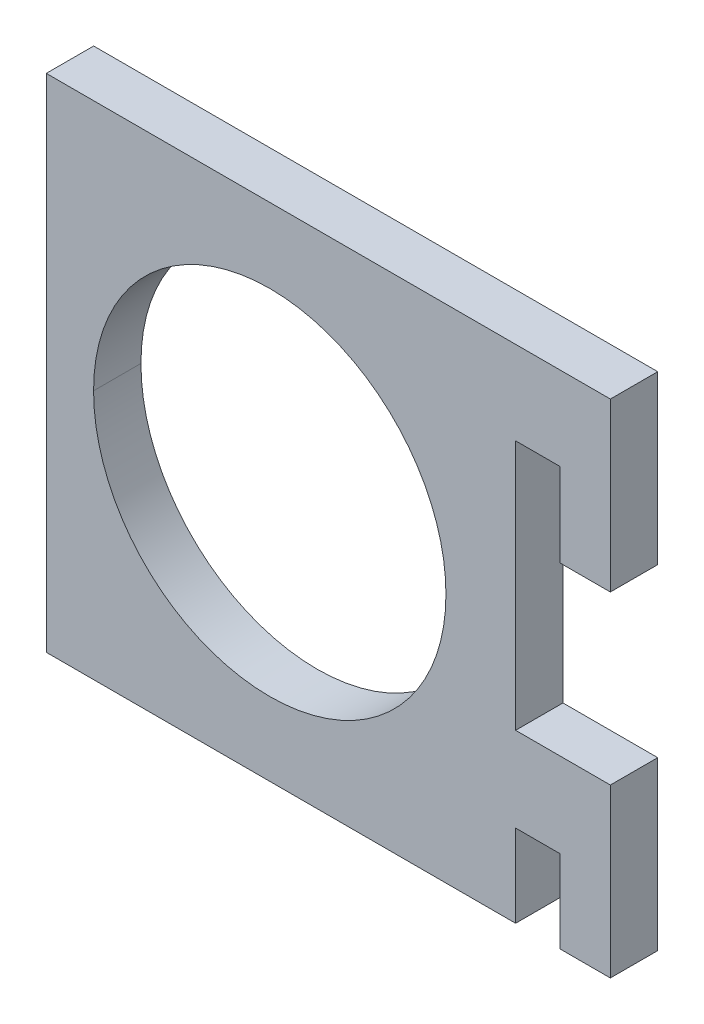
ISO-10303-21;
HEADER;
FILE_DESCRIPTION(('STEP AP214'),'2;1');
FILE_NAME('part.step','',(''),(''),'','','');
FILE_SCHEMA(('AUTOMOTIVE_DESIGN { 1 0 10303 214 1 1 1 1 }'));
ENDSEC;
DATA;
#1=APPLICATION_CONTEXT('core data for automotive mechanical design processes');
#2=APPLICATION_PROTOCOL_DEFINITION('international standard','automotive_design',2000,#1);
#3=PRODUCT_CONTEXT('',#1,'mechanical');
#4=PRODUCT('Part','Part','',(#3));
#5=PRODUCT_RELATED_PRODUCT_CATEGORY('part','',(#4));
#6=PRODUCT_DEFINITION_FORMATION('','',#4);
#7=PRODUCT_DEFINITION_CONTEXT('part definition',#1,'design');
#8=PRODUCT_DEFINITION('design','',#6,#7);
#9=PRODUCT_DEFINITION_SHAPE('','',#8);
#10=(LENGTH_UNIT() NAMED_UNIT(*) SI_UNIT(.MILLI.,.METRE.));
#11=(NAMED_UNIT(*) PLANE_ANGLE_UNIT() SI_UNIT($,.RADIAN.));
#12=(NAMED_UNIT(*) SI_UNIT($,.STERADIAN.) SOLID_ANGLE_UNIT());
#13=UNCERTAINTY_MEASURE_WITH_UNIT(LENGTH_MEASURE(1.E-05),#10,'distance_accuracy_value','');
#14=(GEOMETRIC_REPRESENTATION_CONTEXT(3) GLOBAL_UNCERTAINTY_ASSIGNED_CONTEXT((#13)) GLOBAL_UNIT_ASSIGNED_CONTEXT((#10,
#11,#12)) REPRESENTATION_CONTEXT('',''));
#15=CARTESIAN_POINT('',(0.,0.,0.));
#16=DIRECTION('',(0.,0.,1.));
#17=DIRECTION('',(1.,0.,0.));
#18=AXIS2_PLACEMENT_3D('',#15,#16,#17);
#19=CARTESIAN_POINT('',(-38.6732353810059,-24.0707551250744,4.800000052));
#20=DIRECTION('',(0.,1.,0.));
#21=DIRECTION('',(0.,0.,1.));
#22=AXIS2_PLACEMENT_3D('',#19,#20,#21);
#23=PLANE('',#22);
#24=DIRECTION('',(0.,0.,-1.));
#25=VECTOR('',#24,1.);
#26=CARTESIAN_POINT('',(13.3767646589941,-24.0707551250744,4.800000052));
#27=LINE('',#26,#25);
#28=CARTESIAN_POINT('',(13.3767646589941,-24.0707551250744,4.800000052));
#29=VERTEX_POINT('',#28);
#30=CARTESIAN_POINT('',(13.3767646589941,-24.0707551250744,0.));
#31=VERTEX_POINT('',#30);
#32=EDGE_CURVE('E169',#29,#31,#27,.T.);
#33=ORIENTED_EDGE('',*,*,#32,.T.);
#34=DIRECTION('',(1.,0.,0.));
#35=VECTOR('',#34,1.);
#36=CARTESIAN_POINT('',(-38.6732353810059,-24.0707551250744,0.));
#37=LINE('',#36,#35);
#38=CARTESIAN_POINT('',(18.4767646189941,-24.0707551250744,0.));
#39=VERTEX_POINT('',#38);
#40=EDGE_CURVE('E209',#31,#39,#37,.T.);
#41=ORIENTED_EDGE('',*,*,#40,.T.);
#42=DIRECTION('',(0.,0.,-1.));
#43=VECTOR('',#42,1.);
#44=CARTESIAN_POINT('',(18.4767646189941,-24.0707551250744,4.800000052));
#45=LINE('',#44,#43);
#46=CARTESIAN_POINT('',(18.4767646189941,-24.0707551250744,4.800000052));
#47=VERTEX_POINT('',#46);
#48=EDGE_CURVE('E223',#47,#39,#45,.T.);
#49=ORIENTED_EDGE('',*,*,#48,.F.);
#50=DIRECTION('',(1.,0.,0.));
#51=VECTOR('',#50,1.);
#52=CARTESIAN_POINT('',(-38.6732353810059,-24.0707551250744,4.800000052));
#53=LINE('',#52,#51);
#54=EDGE_CURVE('E195',#29,#47,#53,.T.);
#55=ORIENTED_EDGE('',*,*,#54,.F.);
#56=EDGE_LOOP('',(#33,#41,#49,#55));
#57=FACE_BOUND('',#56,.T.);
#58=ADVANCED_FACE('F36',(#57),#23,.F.);
#59=CARTESIAN_POINT('',(0.,0.,4.800000052));
#60=DIRECTION('',(0.,0.,-1.));
#61=DIRECTION('',(-1.,0.,0.));
#62=AXIS2_PLACEMENT_3D('',#59,#60,#61);
#63=PLANE('',#62);
#64=CARTESIAN_POINT('',(-16.0307785104264,1.2199700795238,4.80000005199999));
#65=DIRECTION('',(0.,0.,1.));
#66=DIRECTION('',(1.,0.,0.));
#67=AXIS2_PLACEMENT_3D('',#64,#65,#66);
#68=CIRCLE('',#67,17.849200014);
#69=CARTESIAN_POINT('',(-33.8798949001682,1.27460747722343,4.800000052));
#70=VERTEX_POINT('',#69);
#71=CARTESIAN_POINT('',(1.81833787931544,1.2746074772121,4.800000052));
#72=VERTEX_POINT('',#71);
#73=EDGE_CURVE('E162',#70,#72,#68,.T.);
#74=ORIENTED_EDGE('',*,*,#73,.F.);
#75=CARTESIAN_POINT('',(-16.0307785104264,1.32924487492533,4.800000052));
#76=DIRECTION('',(0.,0.,-1.));
#77=DIRECTION('',(-1.,0.,0.));
#78=AXIS2_PLACEMENT_3D('',#75,#76,#77);
#79=CIRCLE('',#78,17.849200014);
#80=EDGE_CURVE('E149',#70,#72,#79,.T.);
#81=ORIENTED_EDGE('',*,*,#80,.T.);
#82=EDGE_LOOP('',(#74,#81));
#83=FACE_BOUND('',#82,.T.);
#84=DIRECTION('',(0.,1.,0.));
#85=VECTOR('',#84,1.);
#86=CARTESIAN_POINT('',(13.3767646589941,0.,4.800000052));
#87=LINE('',#86,#85);
#88=CARTESIAN_POINT('',(13.3767646589941,9.7959115415923,4.800000052));
#89=VERTEX_POINT('',#88);
#90=CARTESIAN_POINT('',(13.3767646589941,18.262578208259,4.800000052));
#91=VERTEX_POINT('',#90);
#92=EDGE_CURVE('E278',#89,#91,#87,.T.);
#93=ORIENTED_EDGE('',*,*,#92,.F.);
#94=DIRECTION('',(-1.,0.,0.));
#95=VECTOR('',#94,1.);
#96=CARTESIAN_POINT('',(0.,9.7959115415923,4.800000052));
#97=LINE('',#96,#95);
#98=CARTESIAN_POINT('',(18.4767646189941,9.7959115415923,4.800000052));
#99=VERTEX_POINT('',#98);
#100=EDGE_CURVE('E175',#99,#89,#97,.T.);
#101=ORIENTED_EDGE('',*,*,#100,.F.);
#102=DIRECTION('',(0.,1.,0.));
#103=VECTOR('',#102,1.);
#104=CARTESIAN_POINT('',(18.4767646189941,-24.0707551250744,4.800000052));
#105=LINE('',#104,#103);
#106=CARTESIAN_POINT('',(18.4767646189941,26.7292448749256,4.800000052));
#107=VERTEX_POINT('',#106);
#108=EDGE_CURVE('E200',#99,#107,#105,.T.);
#109=ORIENTED_EDGE('',*,*,#108,.T.);
#110=DIRECTION('',(-1.,0.,0.));
#111=VECTOR('',#110,1.);
#112=CARTESIAN_POINT('',(-38.6732353810059,26.7292448749256,4.800000052));
#113=LINE('',#112,#111);
#114=CARTESIAN_POINT('',(-38.6732353810059,26.7292448749256,4.800000052));
#115=VERTEX_POINT('',#114);
#116=EDGE_CURVE('E204',#107,#115,#113,.T.);
#117=ORIENTED_EDGE('',*,*,#116,.T.);
#118=DIRECTION('',(0.,-1.,0.));
#119=VECTOR('',#118,1.);
#120=CARTESIAN_POINT('',(-38.6732353810059,-24.0707551250744,4.800000052));
#121=LINE('',#120,#119);
#122=CARTESIAN_POINT('',(-38.6732353810059,-24.0707551250744,4.800000052));
#123=VERTEX_POINT('',#122);
#124=EDGE_CURVE('E192',#115,#123,#121,.T.);
#125=ORIENTED_EDGE('',*,*,#124,.T.);
#126=CARTESIAN_POINT('',(8.87676451499411,-24.0707551250744,4.800000052));
#127=VERTEX_POINT('',#126);
#128=EDGE_CURVE('E197',#123,#127,#53,.T.);
#129=ORIENTED_EDGE('',*,*,#128,.T.);
#130=DIRECTION('',(0.,1.,0.));
#131=VECTOR('',#130,1.);
#132=CARTESIAN_POINT('',(8.87676451499411,0.,4.800000052));
#133=LINE('',#132,#131);
#134=CARTESIAN_POINT('',(8.87676451499411,-15.7133632538091,4.800000052));
#135=VERTEX_POINT('',#134);
#136=EDGE_CURVE('E259',#127,#135,#133,.T.);
#137=ORIENTED_EDGE('',*,*,#136,.T.);
#138=DIRECTION('',(1.,0.,0.));
#139=VECTOR('',#138,1.);
#140=CARTESIAN_POINT('',(0.,-15.7133632538091,4.800000052));
#141=LINE('',#140,#139);
#142=CARTESIAN_POINT('',(13.3767646589941,-15.7133632538091,4.800000052));
#143=VERTEX_POINT('',#142);
#144=EDGE_CURVE('E254',#135,#143,#141,.T.);
#145=ORIENTED_EDGE('',*,*,#144,.T.);
#146=DIRECTION('',(0.,1.,0.));
#147=VECTOR('',#146,1.);
#148=CARTESIAN_POINT('',(13.3767646589941,0.,4.800000052));
#149=LINE('',#148,#147);
#150=EDGE_CURVE('E244',#29,#143,#149,.T.);
#151=ORIENTED_EDGE('',*,*,#150,.F.);
#152=ORIENTED_EDGE('',*,*,#54,.T.);
#153=CARTESIAN_POINT('',(18.4767646189941,-7.13742179174103,4.800000052));
#154=VERTEX_POINT('',#153);
#155=EDGE_CURVE('E201',#47,#154,#105,.T.);
#156=ORIENTED_EDGE('',*,*,#155,.T.);
#157=DIRECTION('',(-1.,0.,0.));
#158=VECTOR('',#157,1.);
#159=CARTESIAN_POINT('',(0.,-7.13742179174103,4.800000052));
#160=LINE('',#159,#158);
#161=CARTESIAN_POINT('',(8.87676451499411,-7.13742179174103,4.800000052));
#162=VERTEX_POINT('',#161);
#163=EDGE_CURVE('E164',#154,#162,#160,.T.);
#164=ORIENTED_EDGE('',*,*,#163,.T.);
#165=DIRECTION('',(0.,1.,0.));
#166=VECTOR('',#165,1.);
#167=CARTESIAN_POINT('',(8.87676451499411,0.,4.800000052));
#168=LINE('',#167,#166);
#169=CARTESIAN_POINT('',(8.87676451499411,18.262578208259,4.800000052));
#170=VERTEX_POINT('',#169);
#171=EDGE_CURVE('E161',#162,#170,#168,.T.);
#172=ORIENTED_EDGE('',*,*,#171,.T.);
#173=DIRECTION('',(1.,0.,0.));
#174=VECTOR('',#173,1.);
#175=CARTESIAN_POINT('',(0.,18.262578208259,4.800000052));
#176=LINE('',#175,#174);
#177=EDGE_CURVE('E271',#170,#91,#176,.T.);
#178=ORIENTED_EDGE('',*,*,#177,.T.);
#179=EDGE_LOOP('',(#93,#101,#109,#117,#125,#129,#137,#145,#151,#152,#156,#164,#172,#178));
#180=FACE_BOUND('',#179,.T.);
#181=ADVANCED_FACE('F285',(#83,#180),#63,.F.);
#182=CARTESIAN_POINT('',(0.,0.,0.));
#183=DIRECTION('',(0.,0.,-1.));
#184=DIRECTION('',(-1.,0.,0.));
#185=AXIS2_PLACEMENT_3D('',#182,#183,#184);
#186=PLANE('',#185);
#187=CARTESIAN_POINT('',(-16.0307785104264,1.32924487492533,0.));
#188=DIRECTION('',(0.,0.,-1.));
#189=DIRECTION('',(-1.,0.,0.));
#190=AXIS2_PLACEMENT_3D('',#187,#188,#189);
#191=CIRCLE('',#190,17.849200014);
#192=CARTESIAN_POINT('',(-33.8798949001682,1.27460747722343,0.));
#193=VERTEX_POINT('',#192);
#194=CARTESIAN_POINT('',(1.81833787931544,1.2746074772121,0.));
#195=VERTEX_POINT('',#194);
#196=EDGE_CURVE('E51',#193,#195,#191,.T.);
#197=ORIENTED_EDGE('',*,*,#196,.F.);
#198=CARTESIAN_POINT('',(-16.0307785104264,1.2199700795238,0.));
#199=DIRECTION('',(0.,0.,1.));
#200=DIRECTION('',(1.,0.,0.));
#201=AXIS2_PLACEMENT_3D('',#198,#199,#200);
#202=CIRCLE('',#201,17.849200014);
#203=EDGE_CURVE('E158',#193,#195,#202,.T.);
#204=ORIENTED_EDGE('',*,*,#203,.T.);
#205=EDGE_LOOP('',(#197,#204));
#206=FACE_BOUND('',#205,.T.);
#207=DIRECTION('',(-1.,0.,0.));
#208=VECTOR('',#207,1.);
#209=CARTESIAN_POINT('',(0.,9.7959115415923,0.));
#210=LINE('',#209,#208);
#211=CARTESIAN_POINT('',(18.4767646189941,9.7959115415923,0.));
#212=VERTEX_POINT('',#211);
#213=CARTESIAN_POINT('',(13.3767646589941,9.7959115415923,0.));
#214=VERTEX_POINT('',#213);
#215=EDGE_CURVE('E177',#212,#214,#210,.T.);
#216=ORIENTED_EDGE('',*,*,#215,.T.);
#217=DIRECTION('',(0.,1.,0.));
#218=VECTOR('',#217,1.);
#219=CARTESIAN_POINT('',(13.3767646589941,0.,0.));
#220=LINE('',#219,#218);
#221=CARTESIAN_POINT('',(13.3767646589941,18.262578208259,0.));
#222=VERTEX_POINT('',#221);
#223=EDGE_CURVE('E251',#214,#222,#220,.T.);
#224=ORIENTED_EDGE('',*,*,#223,.T.);
#225=DIRECTION('',(1.,0.,0.));
#226=VECTOR('',#225,1.);
#227=CARTESIAN_POINT('',(0.,18.262578208259,0.));
#228=LINE('',#227,#226);
#229=CARTESIAN_POINT('',(8.87676451499411,18.262578208259,0.));
#230=VERTEX_POINT('',#229);
#231=EDGE_CURVE('E275',#230,#222,#228,.T.);
#232=ORIENTED_EDGE('',*,*,#231,.F.);
#233=DIRECTION('',(0.,1.,0.));
#234=VECTOR('',#233,1.);
#235=CARTESIAN_POINT('',(8.87676451499411,0.,0.));
#236=LINE('',#235,#234);
#237=CARTESIAN_POINT('',(8.87676451499411,-7.13742179174103,0.));
#238=VERTEX_POINT('',#237);
#239=EDGE_CURVE('E172',#238,#230,#236,.T.);
#240=ORIENTED_EDGE('',*,*,#239,.F.);
#241=DIRECTION('',(-1.,0.,0.));
#242=VECTOR('',#241,1.);
#243=CARTESIAN_POINT('',(0.,-7.13742179174103,0.));
#244=LINE('',#243,#242);
#245=CARTESIAN_POINT('',(18.4767646189941,-7.13742179174103,0.));
#246=VERTEX_POINT('',#245);
#247=EDGE_CURVE('E174',#246,#238,#244,.T.);
#248=ORIENTED_EDGE('',*,*,#247,.F.);
#249=DIRECTION('',(0.,1.,0.));
#250=VECTOR('',#249,1.);
#251=CARTESIAN_POINT('',(18.4767646189941,-24.0707551250744,0.));
#252=LINE('',#251,#250);
#253=EDGE_CURVE('E214',#39,#246,#252,.T.);
#254=ORIENTED_EDGE('',*,*,#253,.F.);
#255=ORIENTED_EDGE('',*,*,#40,.F.);
#256=DIRECTION('',(0.,1.,0.));
#257=VECTOR('',#256,1.);
#258=CARTESIAN_POINT('',(13.3767646589941,0.,0.));
#259=LINE('',#258,#257);
#260=CARTESIAN_POINT('',(13.3767646589941,-15.7133632538091,0.));
#261=VERTEX_POINT('',#260);
#262=EDGE_CURVE('E242',#31,#261,#259,.T.);
#263=ORIENTED_EDGE('',*,*,#262,.T.);
#264=DIRECTION('',(1.,0.,0.));
#265=VECTOR('',#264,1.);
#266=CARTESIAN_POINT('',(0.,-15.7133632538091,0.));
#267=LINE('',#266,#265);
#268=CARTESIAN_POINT('',(8.87676451499411,-15.7133632538091,0.));
#269=VERTEX_POINT('',#268);
#270=EDGE_CURVE('E241',#269,#261,#267,.T.);
#271=ORIENTED_EDGE('',*,*,#270,.F.);
#272=DIRECTION('',(0.,1.,0.));
#273=VECTOR('',#272,1.);
#274=CARTESIAN_POINT('',(8.87676451499411,0.,0.));
#275=LINE('',#274,#273);
#276=CARTESIAN_POINT('',(8.87676451499411,-24.0707551250744,0.));
#277=VERTEX_POINT('',#276);
#278=EDGE_CURVE('E238',#277,#269,#275,.T.);
#279=ORIENTED_EDGE('',*,*,#278,.F.);
#280=CARTESIAN_POINT('',(-38.6732353810059,-24.0707551250744,0.));
#281=VERTEX_POINT('',#280);
#282=EDGE_CURVE('E210',#281,#277,#37,.T.);
#283=ORIENTED_EDGE('',*,*,#282,.F.);
#284=DIRECTION('',(0.,-1.,0.));
#285=VECTOR('',#284,1.);
#286=CARTESIAN_POINT('',(-38.6732353810059,-24.0707551250744,0.));
#287=LINE('',#286,#285);
#288=CARTESIAN_POINT('',(-38.6732353810059,26.7292448749256,0.));
#289=VERTEX_POINT('',#288);
#290=EDGE_CURVE('E187',#289,#281,#287,.T.);
#291=ORIENTED_EDGE('',*,*,#290,.F.);
#292=DIRECTION('',(-1.,0.,0.));
#293=VECTOR('',#292,1.);
#294=CARTESIAN_POINT('',(-38.6732353810059,26.7292448749256,0.));
#295=LINE('',#294,#293);
#296=CARTESIAN_POINT('',(18.4767646189941,26.7292448749256,0.));
#297=VERTEX_POINT('',#296);
#298=EDGE_CURVE('E196',#297,#289,#295,.T.);
#299=ORIENTED_EDGE('',*,*,#298,.F.);
#300=EDGE_CURVE('E213',#212,#297,#252,.T.);
#301=ORIENTED_EDGE('',*,*,#300,.F.);
#302=EDGE_LOOP('',(#216,#224,#232,#240,#248,#254,#255,#263,#271,#279,#283,#291,#299,#301));
#303=FACE_BOUND('',#302,.T.);
#304=ADVANCED_FACE('F156',(#206,#303),#186,.T.);
#305=CARTESIAN_POINT('',(0.,9.7959115415923,0.));
#306=DIRECTION('',(0.,1.,0.));
#307=DIRECTION('',(-1.,0.,0.));
#308=AXIS2_PLACEMENT_3D('',#305,#306,#307);
#309=PLANE('',#308);
#310=DIRECTION('',(0.,0.,-1.));
#311=VECTOR('',#310,1.);
#312=CARTESIAN_POINT('',(13.3767646589941,9.7959115415923,4.800000052));
#313=LINE('',#312,#311);
#314=EDGE_CURVE('E267',#89,#214,#313,.T.);
#315=ORIENTED_EDGE('',*,*,#314,.T.);
#316=ORIENTED_EDGE('',*,*,#215,.F.);
#317=DIRECTION('',(0.,0.,1.));
#318=VECTOR('',#317,1.);
#319=CARTESIAN_POINT('',(18.4767646189941,9.7959115415923,0.));
#320=LINE('',#319,#318);
#321=EDGE_CURVE('E185',#212,#99,#320,.T.);
#322=ORIENTED_EDGE('',*,*,#321,.T.);
#323=ORIENTED_EDGE('',*,*,#100,.T.);
#324=EDGE_LOOP('',(#315,#316,#322,#323));
#325=FACE_BOUND('',#324,.T.);
#326=ADVANCED_FACE('F295',(#325),#309,.F.);
#327=CARTESIAN_POINT('',(18.4767646189941,-24.0707551250744,4.800000052));
#328=DIRECTION('',(-1.,0.,0.));
#329=DIRECTION('',(0.,0.,1.));
#330=AXIS2_PLACEMENT_3D('',#327,#328,#329);
#331=PLANE('',#330);
#332=DIRECTION('',(0.,0.,1.));
#333=VECTOR('',#332,1.);
#334=CARTESIAN_POINT('',(18.4767646189941,-7.13742179174103,0.));
#335=LINE('',#334,#333);
#336=EDGE_CURVE('E188',#246,#154,#335,.T.);
#337=ORIENTED_EDGE('',*,*,#336,.T.);
#338=ORIENTED_EDGE('',*,*,#155,.F.);
#339=ORIENTED_EDGE('',*,*,#48,.T.);
#340=ORIENTED_EDGE('',*,*,#253,.T.);
#341=EDGE_LOOP('',(#337,#338,#339,#340));
#342=FACE_BOUND('',#341,.T.);
#343=ADVANCED_FACE('F314',(#342),#331,.F.);
#344=CARTESIAN_POINT('',(-38.6732353810059,-24.0707551250744,4.800000052));
#345=DIRECTION('',(1.,0.,0.));
#346=DIRECTION('',(0.,0.,-1.));
#347=AXIS2_PLACEMENT_3D('',#344,#345,#346);
#348=PLANE('',#347);
#349=ORIENTED_EDGE('',*,*,#290,.T.);
#350=DIRECTION('',(0.,0.,-1.));
#351=VECTOR('',#350,1.);
#352=CARTESIAN_POINT('',(-38.6732353810059,-24.0707551250744,4.800000052));
#353=LINE('',#352,#351);
#354=EDGE_CURVE('E226',#123,#281,#353,.T.);
#355=ORIENTED_EDGE('',*,*,#354,.F.);
#356=ORIENTED_EDGE('',*,*,#124,.F.);
#357=DIRECTION('',(0.,0.,-1.));
#358=VECTOR('',#357,1.);
#359=CARTESIAN_POINT('',(-38.6732353810059,26.7292448749256,4.800000052));
#360=LINE('',#359,#358);
#361=EDGE_CURVE('E206',#115,#289,#360,.T.);
#362=ORIENTED_EDGE('',*,*,#361,.T.);
#363=EDGE_LOOP('',(#349,#355,#356,#362));
#364=FACE_BOUND('',#363,.T.);
#365=ADVANCED_FACE('F38',(#364),#348,.F.);
#366=ORIENTED_EDGE('',*,*,#282,.T.);
#367=DIRECTION('',(0.,0.,-1.));
#368=VECTOR('',#367,1.);
#369=CARTESIAN_POINT('',(8.87676451499411,-24.0707551250744,4.800000052));
#370=LINE('',#369,#368);
#371=EDGE_CURVE('E59',#127,#277,#370,.T.);
#372=ORIENTED_EDGE('',*,*,#371,.F.);
#373=ORIENTED_EDGE('',*,*,#128,.F.);
#374=ORIENTED_EDGE('',*,*,#354,.T.);
#375=EDGE_LOOP('',(#366,#372,#373,#374));
#376=FACE_BOUND('',#375,.T.);
#377=ADVANCED_FACE('F230',(#376),#23,.F.);
#378=ORIENTED_EDGE('',*,*,#108,.F.);
#379=ORIENTED_EDGE('',*,*,#321,.F.);
#380=ORIENTED_EDGE('',*,*,#300,.T.);
#381=DIRECTION('',(0.,0.,-1.));
#382=VECTOR('',#381,1.);
#383=CARTESIAN_POINT('',(18.4767646189941,26.7292448749256,4.800000052));
#384=LINE('',#383,#382);
#385=EDGE_CURVE('E220',#107,#297,#384,.T.);
#386=ORIENTED_EDGE('',*,*,#385,.F.);
#387=EDGE_LOOP('',(#378,#379,#380,#386));
#388=FACE_BOUND('',#387,.T.);
#389=ADVANCED_FACE('F298',(#388),#331,.F.);
#390=CARTESIAN_POINT('',(-38.6732353810059,26.7292448749256,4.800000052));
#391=DIRECTION('',(0.,-1.,0.));
#392=DIRECTION('',(0.,0.,-1.));
#393=AXIS2_PLACEMENT_3D('',#390,#391,#392);
#394=PLANE('',#393);
#395=ORIENTED_EDGE('',*,*,#298,.T.);
#396=ORIENTED_EDGE('',*,*,#361,.F.);
#397=ORIENTED_EDGE('',*,*,#116,.F.);
#398=ORIENTED_EDGE('',*,*,#385,.T.);
#399=EDGE_LOOP('',(#395,#396,#397,#398));
#400=FACE_BOUND('',#399,.T.);
#401=ADVANCED_FACE('F325',(#400),#394,.F.);
#402=CARTESIAN_POINT('',(8.87676451499411,0.,0.));
#403=DIRECTION('',(1.,0.,0.));
#404=DIRECTION('',(0.,0.,-1.));
#405=AXIS2_PLACEMENT_3D('',#402,#403,#404);
#406=PLANE('',#405);
#407=ORIENTED_EDGE('',*,*,#171,.F.);
#408=DIRECTION('',(0.,0.,1.));
#409=VECTOR('',#408,1.);
#410=CARTESIAN_POINT('',(8.87676451499411,-7.13742179174103,0.));
#411=LINE('',#410,#409);
#412=EDGE_CURVE('E179',#238,#162,#411,.T.);
#413=ORIENTED_EDGE('',*,*,#412,.F.);
#414=ORIENTED_EDGE('',*,*,#239,.T.);
#415=DIRECTION('',(0.,0.,-1.));
#416=VECTOR('',#415,1.);
#417=CARTESIAN_POINT('',(8.87676451499411,18.262578208259,4.800000052));
#418=LINE('',#417,#416);
#419=EDGE_CURVE('E270',#170,#230,#418,.T.);
#420=ORIENTED_EDGE('',*,*,#419,.F.);
#421=EDGE_LOOP('',(#407,#413,#414,#420));
#422=FACE_BOUND('',#421,.T.);
#423=ADVANCED_FACE('F308',(#422),#406,.T.);
#424=CARTESIAN_POINT('',(0.,-7.13742179174103,0.));
#425=DIRECTION('',(0.,1.,0.));
#426=DIRECTION('',(0.,0.,1.));
#427=AXIS2_PLACEMENT_3D('',#424,#425,#426);
#428=PLANE('',#427);
#429=ORIENTED_EDGE('',*,*,#163,.F.);
#430=ORIENTED_EDGE('',*,*,#336,.F.);
#431=ORIENTED_EDGE('',*,*,#247,.T.);
#432=ORIENTED_EDGE('',*,*,#412,.T.);
#433=EDGE_LOOP('',(#429,#430,#431,#432));
#434=FACE_BOUND('',#433,.T.);
#435=ADVANCED_FACE('F332',(#434),#428,.T.);
#436=CARTESIAN_POINT('',(-16.0307785104264,1.2199700795238,0.));
#437=DIRECTION('',(0.,0.,1.));
#438=DIRECTION('',(1.,0.,0.));
#439=AXIS2_PLACEMENT_3D('',#436,#437,#438);
#440=CYLINDRICAL_SURFACE('',#439,17.849200014);
#441=ORIENTED_EDGE('',*,*,#203,.F.);
#442=DIRECTION('',(0.,0.,-1.));
#443=VECTOR('',#442,1.);
#444=CARTESIAN_POINT('',(-33.8798949001682,1.27460747722343,2.400000026));
#445=LINE('',#444,#443);
#446=EDGE_CURVE('E11',#193,#70,#445,.F.);
#447=ORIENTED_EDGE('',*,*,#446,.T.);
#448=ORIENTED_EDGE('',*,*,#73,.T.);
#449=DIRECTION('',(0.,0.,-1.));
#450=VECTOR('',#449,1.);
#451=CARTESIAN_POINT('',(1.81833787931544,1.2746074772121,2.400000026));
#452=LINE('',#451,#450);
#453=EDGE_CURVE('E44',#72,#195,#452,.T.);
#454=ORIENTED_EDGE('',*,*,#453,.T.);
#455=EDGE_LOOP('',(#441,#447,#448,#454));
#456=FACE_BOUND('',#455,.T.);
#457=ADVANCED_FACE('F160',(#456),#440,.F.);
#458=CARTESIAN_POINT('',(13.3767646589941,0.,4.800000052));
#459=DIRECTION('',(-1.,0.,0.));
#460=DIRECTION('',(0.,0.,1.));
#461=AXIS2_PLACEMENT_3D('',#458,#459,#460);
#462=PLANE('',#461);
#463=ORIENTED_EDGE('',*,*,#223,.F.);
#464=ORIENTED_EDGE('',*,*,#314,.F.);
#465=ORIENTED_EDGE('',*,*,#92,.T.);
#466=DIRECTION('',(0.,0.,-1.));
#467=VECTOR('',#466,1.);
#468=CARTESIAN_POINT('',(13.3767646589941,18.262578208259,4.800000052));
#469=LINE('',#468,#467);
#470=EDGE_CURVE('E166',#91,#222,#469,.T.);
#471=ORIENTED_EDGE('',*,*,#470,.T.);
#472=EDGE_LOOP('',(#463,#464,#465,#471));
#473=FACE_BOUND('',#472,.T.);
#474=ADVANCED_FACE('F302',(#473),#462,.T.);
#475=CARTESIAN_POINT('',(0.,18.262578208259,4.800000052));
#476=DIRECTION('',(0.,1.,0.));
#477=DIRECTION('',(0.,0.,1.));
#478=AXIS2_PLACEMENT_3D('',#475,#476,#477);
#479=PLANE('',#478);
#480=ORIENTED_EDGE('',*,*,#231,.T.);
#481=ORIENTED_EDGE('',*,*,#470,.F.);
#482=ORIENTED_EDGE('',*,*,#177,.F.);
#483=ORIENTED_EDGE('',*,*,#419,.T.);
#484=EDGE_LOOP('',(#480,#481,#482,#483));
#485=FACE_BOUND('',#484,.T.);
#486=ADVANCED_FACE('F304',(#485),#479,.F.);
#487=CARTESIAN_POINT('',(13.3767646589941,0.,4.800000052));
#488=DIRECTION('',(-1.,0.,0.));
#489=DIRECTION('',(0.,0.,1.));
#490=AXIS2_PLACEMENT_3D('',#487,#488,#489);
#491=PLANE('',#490);
#492=ORIENTED_EDGE('',*,*,#262,.F.);
#493=ORIENTED_EDGE('',*,*,#32,.F.);
#494=ORIENTED_EDGE('',*,*,#150,.T.);
#495=DIRECTION('',(0.,0.,-1.));
#496=VECTOR('',#495,1.);
#497=CARTESIAN_POINT('',(13.3767646589941,-15.7133632538091,4.800000052));
#498=LINE('',#497,#496);
#499=EDGE_CURVE('E249',#143,#261,#498,.T.);
#500=ORIENTED_EDGE('',*,*,#499,.T.);
#501=EDGE_LOOP('',(#492,#493,#494,#500));
#502=FACE_BOUND('',#501,.T.);
#503=ADVANCED_FACE('F318',(#502),#491,.T.);
#504=CARTESIAN_POINT('',(0.,-15.7133632538091,4.800000052));
#505=DIRECTION('',(0.,1.,0.));
#506=DIRECTION('',(0.,0.,1.));
#507=AXIS2_PLACEMENT_3D('',#504,#505,#506);
#508=PLANE('',#507);
#509=ORIENTED_EDGE('',*,*,#270,.T.);
#510=ORIENTED_EDGE('',*,*,#499,.F.);
#511=ORIENTED_EDGE('',*,*,#144,.F.);
#512=DIRECTION('',(0.,0.,-1.));
#513=VECTOR('',#512,1.);
#514=CARTESIAN_POINT('',(8.87676451499411,-15.7133632538091,4.800000052));
#515=LINE('',#514,#513);
#516=EDGE_CURVE('E252',#135,#269,#515,.T.);
#517=ORIENTED_EDGE('',*,*,#516,.T.);
#518=EDGE_LOOP('',(#509,#510,#511,#517));
#519=FACE_BOUND('',#518,.T.);
#520=ADVANCED_FACE('F321',(#519),#508,.F.);
#521=CARTESIAN_POINT('',(8.87676451499411,0.,4.800000052));
#522=DIRECTION('',(-1.,0.,0.));
#523=DIRECTION('',(0.,0.,1.));
#524=AXIS2_PLACEMENT_3D('',#521,#522,#523);
#525=PLANE('',#524);
#526=ORIENTED_EDGE('',*,*,#278,.T.);
#527=ORIENTED_EDGE('',*,*,#516,.F.);
#528=ORIENTED_EDGE('',*,*,#136,.F.);
#529=ORIENTED_EDGE('',*,*,#371,.T.);
#530=EDGE_LOOP('',(#526,#527,#528,#529));
#531=FACE_BOUND('',#530,.T.);
#532=ADVANCED_FACE('F322',(#531),#525,.F.);
#533=CARTESIAN_POINT('',(-16.0307785104264,1.32924487492533,4.800000052));
#534=DIRECTION('',(0.,0.,-1.));
#535=DIRECTION('',(-1.,0.,0.));
#536=AXIS2_PLACEMENT_3D('',#533,#534,#535);
#537=CYLINDRICAL_SURFACE('',#536,17.849200014);
#538=ORIENTED_EDGE('',*,*,#196,.T.);
#539=ORIENTED_EDGE('',*,*,#453,.F.);
#540=ORIENTED_EDGE('',*,*,#80,.F.);
#541=ORIENTED_EDGE('',*,*,#446,.F.);
#542=EDGE_LOOP('',(#538,#539,#540,#541));
#543=FACE_BOUND('',#542,.T.);
#544=ADVANCED_FACE('F147',(#543),#537,.F.);
#545=CLOSED_SHELL('',(#58,#181,#304,#326,#343,#365,#377,#389,#401,#423,#435,#457,#474,#486,#503,
#520,#532,#544));
#546=MANIFOLD_SOLID_BREP('B2',#545);
#547=ADVANCED_BREP_SHAPE_REPRESENTATION('',(#18,#546),#14);
#548=SHAPE_DEFINITION_REPRESENTATION(#9,#547);
ENDSEC;
END-ISO-10303-21;
